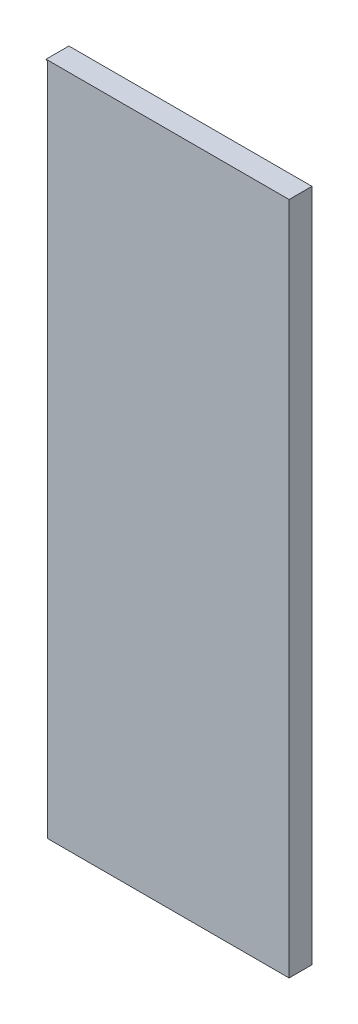
ISO-10303-21;
HEADER;
FILE_DESCRIPTION(('STEP AP214'),'2;1');
FILE_NAME('part.step','',(''),(''),'','','');
FILE_SCHEMA(('AUTOMOTIVE_DESIGN { 1 0 10303 214 1 1 1 1 }'));
ENDSEC;
DATA;
#1=APPLICATION_CONTEXT('core data for automotive mechanical design processes');
#2=APPLICATION_PROTOCOL_DEFINITION('international standard','automotive_design',2000,#1);
#3=PRODUCT_CONTEXT('',#1,'mechanical');
#4=PRODUCT('Part','Part','',(#3));
#5=PRODUCT_RELATED_PRODUCT_CATEGORY('part','',(#4));
#6=PRODUCT_DEFINITION_FORMATION('','',#4);
#7=PRODUCT_DEFINITION_CONTEXT('part definition',#1,'design');
#8=PRODUCT_DEFINITION('design','',#6,#7);
#9=PRODUCT_DEFINITION_SHAPE('','',#8);
#10=(LENGTH_UNIT() NAMED_UNIT(*) SI_UNIT(.MILLI.,.METRE.));
#11=(NAMED_UNIT(*) PLANE_ANGLE_UNIT() SI_UNIT($,.RADIAN.));
#12=(NAMED_UNIT(*) SI_UNIT($,.STERADIAN.) SOLID_ANGLE_UNIT());
#13=UNCERTAINTY_MEASURE_WITH_UNIT(LENGTH_MEASURE(1.E-05),#10,'distance_accuracy_value','');
#14=(GEOMETRIC_REPRESENTATION_CONTEXT(3) GLOBAL_UNCERTAINTY_ASSIGNED_CONTEXT((#13)) GLOBAL_UNIT_ASSIGNED_CONTEXT((#10,
#11,#12)) REPRESENTATION_CONTEXT('',''));
#15=CARTESIAN_POINT('',(0.,0.,0.));
#16=DIRECTION('',(0.,0.,1.));
#17=DIRECTION('',(1.,0.,0.));
#18=AXIS2_PLACEMENT_3D('',#15,#16,#17);
#19=CARTESIAN_POINT('',(2.65999976,-7.37905052,0.499999));
#20=DIRECTION('',(0.,0.,1.));
#21=DIRECTION('',(1.,0.,0.));
#22=AXIS2_PLACEMENT_3D('',#19,#20,#21);
#23=PLANE('',#22);
#24=DIRECTION('',(0.,1.,0.));
#25=VECTOR('',#24,1.);
#26=CARTESIAN_POINT('',(-2.62999982,-7.37905052,0.499999));
#27=LINE('',#26,#25);
#28=CARTESIAN_POINT('',(-2.62999982,-7.37905052,0.499999));
#29=VERTEX_POINT('',#28);
#30=CARTESIAN_POINT('',(-2.62999982,7.34905058,0.499999));
#31=VERTEX_POINT('',#30);
#32=EDGE_CURVE('E87',#29,#31,#27,.T.);
#33=ORIENTED_EDGE('',*,*,#32,.F.);
#34=DIRECTION('',(1.,0.,0.));
#35=VECTOR('',#34,1.);
#36=CARTESIAN_POINT('',(2.65999976,-7.37905052,0.499999));
#37=LINE('',#36,#35);
#38=CARTESIAN_POINT('',(2.65999976,-7.37905052,0.499999));
#39=VERTEX_POINT('',#38);
#40=EDGE_CURVE('E76',#39,#29,#37,.F.);
#41=ORIENTED_EDGE('',*,*,#40,.F.);
#42=DIRECTION('',(0.,1.,0.));
#43=VECTOR('',#42,1.);
#44=CARTESIAN_POINT('',(2.65999976,7.37905052,0.499999));
#45=LINE('',#44,#43);
#46=CARTESIAN_POINT('',(2.65999976,7.37905052,0.499999));
#47=VERTEX_POINT('',#46);
#48=EDGE_CURVE('E20',#47,#39,#45,.F.);
#49=ORIENTED_EDGE('',*,*,#48,.F.);
#50=DIRECTION('',(1.,0.,0.));
#51=VECTOR('',#50,1.);
#52=CARTESIAN_POINT('',(-2.65999976,7.37905052,0.499999));
#53=LINE('',#52,#51);
#54=CARTESIAN_POINT('',(-2.65999975999999,7.37905052000001,0.499999));
#55=VERTEX_POINT('',#54);
#56=EDGE_CURVE('E65',#55,#47,#53,.T.);
#57=ORIENTED_EDGE('',*,*,#56,.F.);
#58=DIRECTION('',(0.707106781186048,-0.707106781187048,0.));
#59=VECTOR('',#58,1.);
#60=CARTESIAN_POINT('',(-2.62999982,7.34905058,0.499999));
#61=LINE('',#60,#59);
#62=EDGE_CURVE('E60',#31,#55,#61,.F.);
#63=ORIENTED_EDGE('',*,*,#62,.F.);
#64=EDGE_LOOP('',(#33,#41,#49,#57,#63));
#65=FACE_BOUND('',#64,.T.);
#66=ADVANCED_FACE('F17',(#65),#23,.T.);
#67=CARTESIAN_POINT('',(2.65999976,7.37905052,0.));
#68=DIRECTION('',(1.,0.,0.));
#69=DIRECTION('',(0.,0.,-1.));
#70=AXIS2_PLACEMENT_3D('',#67,#68,#69);
#71=PLANE('',#70);
#72=DIRECTION('',(0.,0.,-1.));
#73=VECTOR('',#72,1.);
#74=CARTESIAN_POINT('',(2.65999976,-7.37905052,0.));
#75=LINE('',#74,#73);
#76=CARTESIAN_POINT('',(2.65999976,-7.37905052,0.));
#77=VERTEX_POINT('',#76);
#78=EDGE_CURVE('E91',#77,#39,#75,.F.);
#79=ORIENTED_EDGE('',*,*,#78,.F.);
#80=DIRECTION('',(0.,1.,0.));
#81=VECTOR('',#80,1.);
#82=CARTESIAN_POINT('',(2.65999976,-7.37905052,0.));
#83=LINE('',#82,#81);
#84=CARTESIAN_POINT('',(2.65999976,7.37905052,0.));
#85=VERTEX_POINT('',#84);
#86=EDGE_CURVE('E82',#77,#85,#83,.T.);
#87=ORIENTED_EDGE('',*,*,#86,.T.);
#88=DIRECTION('',(0.,0.,1.));
#89=VECTOR('',#88,1.);
#90=CARTESIAN_POINT('',(2.65999976,7.37905052,0.));
#91=LINE('',#90,#89);
#92=EDGE_CURVE('E70',#47,#85,#91,.F.);
#93=ORIENTED_EDGE('',*,*,#92,.F.);
#94=ORIENTED_EDGE('',*,*,#48,.T.);
#95=EDGE_LOOP('',(#79,#87,#93,#94));
#96=FACE_BOUND('',#95,.T.);
#97=ADVANCED_FACE('F81',(#96),#71,.T.);
#98=CARTESIAN_POINT('',(-2.65999976,7.37905052,0.));
#99=DIRECTION('',(0.,1.,0.));
#100=DIRECTION('',(0.,0.,1.));
#101=AXIS2_PLACEMENT_3D('',#98,#99,#100);
#102=PLANE('',#101);
#103=ORIENTED_EDGE('',*,*,#92,.T.);
#104=DIRECTION('',(1.,0.,0.));
#105=VECTOR('',#104,1.);
#106=CARTESIAN_POINT('',(2.65999976,7.37905052,0.));
#107=LINE('',#106,#105);
#108=CARTESIAN_POINT('',(-2.65999975999999,7.37905052000001,0.));
#109=VERTEX_POINT('',#108);
#110=EDGE_CURVE('E96',#85,#109,#107,.F.);
#111=ORIENTED_EDGE('',*,*,#110,.T.);
#112=DIRECTION('',(0.,0.,1.));
#113=VECTOR('',#112,1.);
#114=CARTESIAN_POINT('',(-2.65999975999998,7.37905052000002,0.));
#115=LINE('',#114,#113);
#116=EDGE_CURVE('E72',#55,#109,#115,.F.);
#117=ORIENTED_EDGE('',*,*,#116,.F.);
#118=ORIENTED_EDGE('',*,*,#56,.T.);
#119=EDGE_LOOP('',(#103,#111,#117,#118));
#120=FACE_BOUND('',#119,.T.);
#121=ADVANCED_FACE('F67',(#120),#102,.T.);
#122=CARTESIAN_POINT('',(-2.62999982,7.34905058,0.));
#123=DIRECTION('',(-0.707106781187048,-0.707106781186048,0.));
#124=DIRECTION('',(0.707106781186048,-0.707106781187048,0.));
#125=AXIS2_PLACEMENT_3D('',#122,#123,#124);
#126=PLANE('',#125);
#127=ORIENTED_EDGE('',*,*,#116,.T.);
#128=DIRECTION('',(0.707106781186558,-0.707106781186537,0.));
#129=VECTOR('',#128,1.);
#130=CARTESIAN_POINT('',(-2.65999976,7.37905052,0.));
#131=LINE('',#130,#129);
#132=CARTESIAN_POINT('',(-2.62999982,7.34905058,0.));
#133=VERTEX_POINT('',#132);
#134=EDGE_CURVE('E98',#109,#133,#131,.T.);
#135=ORIENTED_EDGE('',*,*,#134,.T.);
#136=DIRECTION('',(0.,0.,1.));
#137=VECTOR('',#136,1.);
#138=CARTESIAN_POINT('',(-2.62999982,7.34905058,0.));
#139=LINE('',#138,#137);
#140=EDGE_CURVE('E89',#31,#133,#139,.F.);
#141=ORIENTED_EDGE('',*,*,#140,.F.);
#142=ORIENTED_EDGE('',*,*,#62,.T.);
#143=EDGE_LOOP('',(#127,#135,#141,#142));
#144=FACE_BOUND('',#143,.T.);
#145=ADVANCED_FACE('F108',(#144),#126,.T.);
#146=CARTESIAN_POINT('',(-2.62999982,-7.37905052,0.));
#147=DIRECTION('',(-1.,0.,0.));
#148=DIRECTION('',(0.,0.,1.));
#149=AXIS2_PLACEMENT_3D('',#146,#147,#148);
#150=PLANE('',#149);
#151=ORIENTED_EDGE('',*,*,#140,.T.);
#152=DIRECTION('',(0.,1.,0.));
#153=VECTOR('',#152,1.);
#154=CARTESIAN_POINT('',(-2.62999982,-7.37905052,0.));
#155=LINE('',#154,#153);
#156=CARTESIAN_POINT('',(-2.62999982,-7.37905052,0.));
#157=VERTEX_POINT('',#156);
#158=EDGE_CURVE('E26',#133,#157,#155,.F.);
#159=ORIENTED_EDGE('',*,*,#158,.T.);
#160=DIRECTION('',(0.,0.,-1.));
#161=VECTOR('',#160,1.);
#162=CARTESIAN_POINT('',(-2.62999982,-7.37905052,0.));
#163=LINE('',#162,#161);
#164=EDGE_CURVE('E34',#29,#157,#163,.T.);
#165=ORIENTED_EDGE('',*,*,#164,.F.);
#166=ORIENTED_EDGE('',*,*,#32,.T.);
#167=EDGE_LOOP('',(#151,#159,#165,#166));
#168=FACE_BOUND('',#167,.T.);
#169=ADVANCED_FACE('F104',(#168),#150,.T.);
#170=CARTESIAN_POINT('',(2.65999976,-7.37905052,0.));
#171=DIRECTION('',(0.,-1.,0.));
#172=DIRECTION('',(0.,0.,-1.));
#173=AXIS2_PLACEMENT_3D('',#170,#171,#172);
#174=PLANE('',#173);
#175=ORIENTED_EDGE('',*,*,#164,.T.);
#176=DIRECTION('',(1.,0.,0.));
#177=VECTOR('',#176,1.);
#178=CARTESIAN_POINT('',(2.65999976,-7.37905052,0.));
#179=LINE('',#178,#177);
#180=EDGE_CURVE('E11',#157,#77,#179,.T.);
#181=ORIENTED_EDGE('',*,*,#180,.T.);
#182=ORIENTED_EDGE('',*,*,#78,.T.);
#183=ORIENTED_EDGE('',*,*,#40,.T.);
#184=EDGE_LOOP('',(#175,#181,#182,#183));
#185=FACE_BOUND('',#184,.T.);
#186=ADVANCED_FACE('F116',(#185),#174,.T.);
#187=CARTESIAN_POINT('',(2.65999976,-7.37905052,0.));
#188=DIRECTION('',(0.,0.,1.));
#189=DIRECTION('',(1.,0.,0.));
#190=AXIS2_PLACEMENT_3D('',#187,#188,#189);
#191=PLANE('',#190);
#192=ORIENTED_EDGE('',*,*,#158,.F.);
#193=ORIENTED_EDGE('',*,*,#134,.F.);
#194=ORIENTED_EDGE('',*,*,#110,.F.);
#195=ORIENTED_EDGE('',*,*,#86,.F.);
#196=ORIENTED_EDGE('',*,*,#180,.F.);
#197=EDGE_LOOP('',(#192,#193,#194,#195,#196));
#198=FACE_BOUND('',#197,.T.);
#199=ADVANCED_FACE('F107',(#198),#191,.F.);
#200=CLOSED_SHELL('',(#66,#97,#121,#145,#169,#186,#199));
#201=MANIFOLD_SOLID_BREP('B1',#200);
#202=ADVANCED_BREP_SHAPE_REPRESENTATION('',(#18,#201),#14);
#203=SHAPE_DEFINITION_REPRESENTATION(#9,#202);
ENDSEC;
END-ISO-10303-21;
